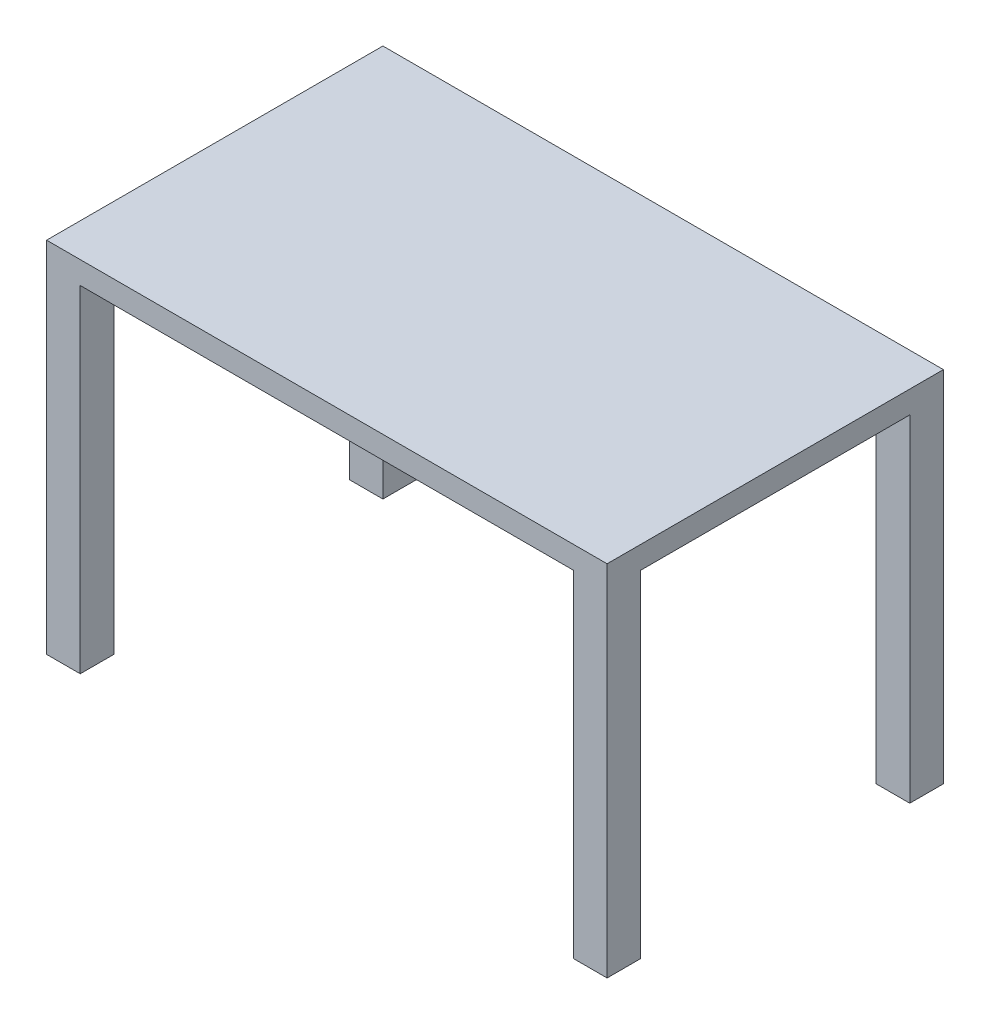
ISO-10303-21;
HEADER;
FILE_DESCRIPTION(('STEP AP214'),'2;1');
FILE_NAME('part.step','',(''),(''),'','','');
FILE_SCHEMA(('AUTOMOTIVE_DESIGN { 1 0 10303 214 1 1 1 1 }'));
ENDSEC;
DATA;
#1=APPLICATION_CONTEXT('core data for automotive mechanical design processes');
#2=APPLICATION_PROTOCOL_DEFINITION('international standard','automotive_design',2000,#1);
#3=PRODUCT_CONTEXT('',#1,'mechanical');
#4=PRODUCT('Part','Part','',(#3));
#5=PRODUCT_RELATED_PRODUCT_CATEGORY('part','',(#4));
#6=PRODUCT_DEFINITION_FORMATION('','',#4);
#7=PRODUCT_DEFINITION_CONTEXT('part definition',#1,'design');
#8=PRODUCT_DEFINITION('design','',#6,#7);
#9=PRODUCT_DEFINITION_SHAPE('','',#8);
#10=(LENGTH_UNIT() NAMED_UNIT(*) SI_UNIT(.MILLI.,.METRE.));
#11=(NAMED_UNIT(*) PLANE_ANGLE_UNIT() SI_UNIT($,.RADIAN.));
#12=(NAMED_UNIT(*) SI_UNIT($,.STERADIAN.) SOLID_ANGLE_UNIT());
#13=UNCERTAINTY_MEASURE_WITH_UNIT(LENGTH_MEASURE(1.E-05),#10,'distance_accuracy_value','');
#14=(GEOMETRIC_REPRESENTATION_CONTEXT(3) GLOBAL_UNCERTAINTY_ASSIGNED_CONTEXT((#13)) GLOBAL_UNIT_ASSIGNED_CONTEXT((#10,
#11,#12)) REPRESENTATION_CONTEXT('',''));
#15=CARTESIAN_POINT('',(0.,0.,0.));
#16=DIRECTION('',(0.,0.,1.));
#17=DIRECTION('',(1.,0.,0.));
#18=AXIS2_PLACEMENT_3D('',#15,#16,#17);
#19=CARTESIAN_POINT('',(0.,0.,0.));
#20=DIRECTION('',(0.,-1.,0.));
#21=DIRECTION('',(0.,0.,-1.));
#22=AXIS2_PLACEMENT_3D('',#19,#20,#21);
#23=PLANE('',#22);
#24=DIRECTION('',(-1.,0.,0.));
#25=VECTOR('',#24,1.);
#26=CARTESIAN_POINT('',(-125.,0.,-60.));
#27=LINE('',#26,#25);
#28=CARTESIAN_POINT('',(-110.,0.,-60.));
#29=VERTEX_POINT('',#28);
#30=CARTESIAN_POINT('',(-125.,0.,-60.0000000000001));
#31=VERTEX_POINT('',#30);
#32=EDGE_CURVE('E174',#29,#31,#27,.T.);
#33=ORIENTED_EDGE('',*,*,#32,.F.);
#34=DIRECTION('',(0.,0.,1.));
#35=VECTOR('',#34,1.);
#36=CARTESIAN_POINT('',(-110.,0.,-75.));
#37=LINE('',#36,#35);
#38=CARTESIAN_POINT('',(-110.,0.,-75.));
#39=VERTEX_POINT('',#38);
#40=EDGE_CURVE('E518',#39,#29,#37,.T.);
#41=ORIENTED_EDGE('',*,*,#40,.F.);
#42=DIRECTION('',(-1.,0.,0.));
#43=VECTOR('',#42,1.);
#44=CARTESIAN_POINT('',(-125.,0.,-75.));
#45=LINE('',#44,#43);
#46=CARTESIAN_POINT('',(110.,0.,-75.));
#47=VERTEX_POINT('',#46);
#48=EDGE_CURVE('E179',#47,#39,#45,.T.);
#49=ORIENTED_EDGE('',*,*,#48,.F.);
#50=DIRECTION('',(0.,0.,-1.));
#51=VECTOR('',#50,1.);
#52=CARTESIAN_POINT('',(110.,0.,-75.));
#53=LINE('',#52,#51);
#54=CARTESIAN_POINT('',(110.,0.,-60.));
#55=VERTEX_POINT('',#54);
#56=EDGE_CURVE('E254',#55,#47,#53,.T.);
#57=ORIENTED_EDGE('',*,*,#56,.F.);
#58=DIRECTION('',(-1.,0.,0.));
#59=VECTOR('',#58,1.);
#60=CARTESIAN_POINT('',(125.,0.,-60.));
#61=LINE('',#60,#59);
#62=CARTESIAN_POINT('',(125.,0.,-60.));
#63=VERTEX_POINT('',#62);
#64=EDGE_CURVE('E248',#63,#55,#61,.T.);
#65=ORIENTED_EDGE('',*,*,#64,.F.);
#66=DIRECTION('',(0.,0.,-1.));
#67=VECTOR('',#66,1.);
#68=CARTESIAN_POINT('',(125.,0.,75.));
#69=LINE('',#68,#67);
#70=CARTESIAN_POINT('',(125.,0.,60.));
#71=VERTEX_POINT('',#70);
#72=EDGE_CURVE('E281',#71,#63,#69,.T.);
#73=ORIENTED_EDGE('',*,*,#72,.F.);
#74=DIRECTION('',(1.,0.,0.));
#75=VECTOR('',#74,1.);
#76=CARTESIAN_POINT('',(125.,0.,60.));
#77=LINE('',#76,#75);
#78=CARTESIAN_POINT('',(110.,0.,60.));
#79=VERTEX_POINT('',#78);
#80=EDGE_CURVE('E222',#79,#71,#77,.T.);
#81=ORIENTED_EDGE('',*,*,#80,.F.);
#82=DIRECTION('',(0.,0.,-1.));
#83=VECTOR('',#82,1.);
#84=CARTESIAN_POINT('',(110.,0.,75.));
#85=LINE('',#84,#83);
#86=CARTESIAN_POINT('',(110.,0.,75.));
#87=VERTEX_POINT('',#86);
#88=EDGE_CURVE('E216',#87,#79,#85,.T.);
#89=ORIENTED_EDGE('',*,*,#88,.F.);
#90=DIRECTION('',(1.,0.,0.));
#91=VECTOR('',#90,1.);
#92=CARTESIAN_POINT('',(-125.,0.,75.));
#93=LINE('',#92,#91);
#94=CARTESIAN_POINT('',(-110.,0.,75.));
#95=VERTEX_POINT('',#94);
#96=EDGE_CURVE('E287',#95,#87,#93,.T.);
#97=ORIENTED_EDGE('',*,*,#96,.F.);
#98=DIRECTION('',(0.,0.,1.));
#99=VECTOR('',#98,1.);
#100=CARTESIAN_POINT('',(-110.,0.,75.));
#101=LINE('',#100,#99);
#102=CARTESIAN_POINT('',(-110.,0.,60.));
#103=VERTEX_POINT('',#102);
#104=EDGE_CURVE('E185',#103,#95,#101,.T.);
#105=ORIENTED_EDGE('',*,*,#104,.F.);
#106=DIRECTION('',(1.,0.,0.));
#107=VECTOR('',#106,1.);
#108=CARTESIAN_POINT('',(-125.,0.,60.));
#109=LINE('',#108,#107);
#110=CARTESIAN_POINT('',(-125.,0.,60.));
#111=VERTEX_POINT('',#110);
#112=EDGE_CURVE('E181',#111,#103,#109,.T.);
#113=ORIENTED_EDGE('',*,*,#112,.F.);
#114=DIRECTION('',(0.,0.,1.));
#115=VECTOR('',#114,1.);
#116=CARTESIAN_POINT('',(-125.,0.,75.));
#117=LINE('',#116,#115);
#118=EDGE_CURVE('E301',#31,#111,#117,.T.);
#119=ORIENTED_EDGE('',*,*,#118,.F.);
#120=EDGE_LOOP('',(#33,#41,#49,#57,#65,#73,#81,#89,#97,#105,#113,#119));
#121=FACE_BOUND('',#120,.T.);
#122=ADVANCED_FACE('F39',(#121),#23,.T.);
#123=CARTESIAN_POINT('',(125.,10.,75.));
#124=DIRECTION('',(-1.,0.,0.));
#125=DIRECTION('',(0.,0.,1.));
#126=AXIS2_PLACEMENT_3D('',#123,#124,#125);
#127=PLANE('',#126);
#128=DIRECTION('',(0.,-1.,0.));
#129=VECTOR('',#128,1.);
#130=CARTESIAN_POINT('',(125.,10.,75.));
#131=LINE('',#130,#129);
#132=CARTESIAN_POINT('',(125.,10.,75.));
#133=VERTEX_POINT('',#132);
#134=CARTESIAN_POINT('',(125.,-150.,75.));
#135=VERTEX_POINT('',#134);
#136=EDGE_CURVE('E296',#133,#135,#131,.T.);
#137=ORIENTED_EDGE('',*,*,#136,.T.);
#138=DIRECTION('',(0.,0.,1.));
#139=VECTOR('',#138,1.);
#140=CARTESIAN_POINT('',(125.,-150.,75.));
#141=LINE('',#140,#139);
#142=CARTESIAN_POINT('',(125.,-150.,60.));
#143=VERTEX_POINT('',#142);
#144=EDGE_CURVE('E228',#143,#135,#141,.T.);
#145=ORIENTED_EDGE('',*,*,#144,.F.);
#146=DIRECTION('',(0.,1.,0.));
#147=VECTOR('',#146,1.);
#148=CARTESIAN_POINT('',(125.,-150.,60.));
#149=LINE('',#148,#147);
#150=EDGE_CURVE('E232',#143,#71,#149,.T.);
#151=ORIENTED_EDGE('',*,*,#150,.T.);
#152=ORIENTED_EDGE('',*,*,#72,.T.);
#153=DIRECTION('',(0.,1.,0.));
#154=VECTOR('',#153,1.);
#155=CARTESIAN_POINT('',(125.,-150.,-60.));
#156=LINE('',#155,#154);
#157=CARTESIAN_POINT('',(125.,-150.,-60.));
#158=VERTEX_POINT('',#157);
#159=EDGE_CURVE('E277',#158,#63,#156,.T.);
#160=ORIENTED_EDGE('',*,*,#159,.F.);
#161=DIRECTION('',(0.,0.,1.));
#162=VECTOR('',#161,1.);
#163=CARTESIAN_POINT('',(125.,-150.,-75.));
#164=LINE('',#163,#162);
#165=CARTESIAN_POINT('',(125.,-150.,-75.));
#166=VERTEX_POINT('',#165);
#167=EDGE_CURVE('E249',#166,#158,#164,.T.);
#168=ORIENTED_EDGE('',*,*,#167,.F.);
#169=DIRECTION('',(0.,-1.,0.));
#170=VECTOR('',#169,1.);
#171=CARTESIAN_POINT('',(125.,10.,-75.));
#172=LINE('',#171,#170);
#173=CARTESIAN_POINT('',(125.,10.,-75.));
#174=VERTEX_POINT('',#173);
#175=EDGE_CURVE('E11',#174,#166,#172,.T.);
#176=ORIENTED_EDGE('',*,*,#175,.F.);
#177=DIRECTION('',(0.,0.,-1.));
#178=VECTOR('',#177,1.);
#179=CARTESIAN_POINT('',(125.,10.,75.));
#180=LINE('',#179,#178);
#181=EDGE_CURVE('E282',#133,#174,#180,.T.);
#182=ORIENTED_EDGE('',*,*,#181,.F.);
#183=EDGE_LOOP('',(#137,#145,#151,#152,#160,#168,#176,#182));
#184=FACE_BOUND('',#183,.T.);
#185=ADVANCED_FACE('F41',(#184),#127,.F.);
#186=CARTESIAN_POINT('',(-125.,10.,-75.));
#187=DIRECTION('',(0.,0.,1.));
#188=DIRECTION('',(1.,0.,0.));
#189=AXIS2_PLACEMENT_3D('',#186,#187,#188);
#190=PLANE('',#189);
#191=ORIENTED_EDGE('',*,*,#175,.T.);
#192=DIRECTION('',(1.,0.,0.));
#193=VECTOR('',#192,1.);
#194=CARTESIAN_POINT('',(125.,-150.,-75.));
#195=LINE('',#194,#193);
#196=CARTESIAN_POINT('',(110.,-150.,-75.));
#197=VERTEX_POINT('',#196);
#198=EDGE_CURVE('E260',#197,#166,#195,.T.);
#199=ORIENTED_EDGE('',*,*,#198,.F.);
#200=DIRECTION('',(0.,1.,0.));
#201=VECTOR('',#200,1.);
#202=CARTESIAN_POINT('',(110.,-150.,-75.));
#203=LINE('',#202,#201);
#204=EDGE_CURVE('E264',#197,#47,#203,.T.);
#205=ORIENTED_EDGE('',*,*,#204,.T.);
#206=ORIENTED_EDGE('',*,*,#48,.T.);
#207=DIRECTION('',(0.,1.,0.));
#208=VECTOR('',#207,1.);
#209=CARTESIAN_POINT('',(-110.,-150.,-75.));
#210=LINE('',#209,#208);
#211=CARTESIAN_POINT('',(-110.,-150.,-75.));
#212=VERTEX_POINT('',#211);
#213=EDGE_CURVE('E157',#212,#39,#210,.T.);
#214=ORIENTED_EDGE('',*,*,#213,.F.);
#215=DIRECTION('',(1.,0.,0.));
#216=VECTOR('',#215,1.);
#217=CARTESIAN_POINT('',(-125.,-150.,-75.));
#218=LINE('',#217,#216);
#219=CARTESIAN_POINT('',(-125.,-150.,-75.));
#220=VERTEX_POINT('',#219);
#221=EDGE_CURVE('E165',#220,#212,#218,.T.);
#222=ORIENTED_EDGE('',*,*,#221,.F.);
#223=DIRECTION('',(0.,-1.,0.));
#224=VECTOR('',#223,1.);
#225=CARTESIAN_POINT('',(-125.,10.,-75.));
#226=LINE('',#225,#224);
#227=CARTESIAN_POINT('',(-125.,10.,-75.));
#228=VERTEX_POINT('',#227);
#229=EDGE_CURVE('E48',#228,#220,#226,.T.);
#230=ORIENTED_EDGE('',*,*,#229,.F.);
#231=DIRECTION('',(-1.,0.,0.));
#232=VECTOR('',#231,1.);
#233=CARTESIAN_POINT('',(-125.,10.,-75.));
#234=LINE('',#233,#232);
#235=EDGE_CURVE('E286',#174,#228,#234,.T.);
#236=ORIENTED_EDGE('',*,*,#235,.F.);
#237=EDGE_LOOP('',(#191,#199,#205,#206,#214,#222,#230,#236));
#238=FACE_BOUND('',#237,.T.);
#239=ADVANCED_FACE('F177',(#238),#190,.F.);
#240=CARTESIAN_POINT('',(-125.,10.,75.));
#241=DIRECTION('',(1.,0.,0.));
#242=DIRECTION('',(0.,0.,-1.));
#243=AXIS2_PLACEMENT_3D('',#240,#241,#242);
#244=PLANE('',#243);
#245=ORIENTED_EDGE('',*,*,#229,.T.);
#246=DIRECTION('',(0.,0.,-1.));
#247=VECTOR('',#246,1.);
#248=CARTESIAN_POINT('',(-125.,-150.,-75.));
#249=LINE('',#248,#247);
#250=CARTESIAN_POINT('',(-125.,-150.,-60.));
#251=VERTEX_POINT('',#250);
#252=EDGE_CURVE('E170',#251,#220,#249,.T.);
#253=ORIENTED_EDGE('',*,*,#252,.F.);
#254=DIRECTION('',(0.,1.,0.));
#255=VECTOR('',#254,1.);
#256=CARTESIAN_POINT('',(-125.,-150.,-60.));
#257=LINE('',#256,#255);
#258=EDGE_CURVE('E55',#251,#31,#257,.T.);
#259=ORIENTED_EDGE('',*,*,#258,.T.);
#260=ORIENTED_EDGE('',*,*,#118,.T.);
#261=DIRECTION('',(0.,1.,0.));
#262=VECTOR('',#261,1.);
#263=CARTESIAN_POINT('',(-125.,-150.,60.));
#264=LINE('',#263,#262);
#265=CARTESIAN_POINT('',(-125.,-150.,60.));
#266=VERTEX_POINT('',#265);
#267=EDGE_CURVE('E212',#266,#111,#264,.T.);
#268=ORIENTED_EDGE('',*,*,#267,.F.);
#269=DIRECTION('',(0.,0.,-1.));
#270=VECTOR('',#269,1.);
#271=CARTESIAN_POINT('',(-125.,-150.,75.));
#272=LINE('',#271,#270);
#273=CARTESIAN_POINT('',(-125.,-150.,75.));
#274=VERTEX_POINT('',#273);
#275=EDGE_CURVE('E190',#274,#266,#272,.T.);
#276=ORIENTED_EDGE('',*,*,#275,.F.);
#277=DIRECTION('',(0.,-1.,0.));
#278=VECTOR('',#277,1.);
#279=CARTESIAN_POINT('',(-125.,10.,75.));
#280=LINE('',#279,#278);
#281=CARTESIAN_POINT('',(-125.,10.,75.));
#282=VERTEX_POINT('',#281);
#283=EDGE_CURVE('E308',#282,#274,#280,.T.);
#284=ORIENTED_EDGE('',*,*,#283,.F.);
#285=DIRECTION('',(0.,0.,1.));
#286=VECTOR('',#285,1.);
#287=CARTESIAN_POINT('',(-125.,10.,75.));
#288=LINE('',#287,#286);
#289=EDGE_CURVE('E290',#228,#282,#288,.T.);
#290=ORIENTED_EDGE('',*,*,#289,.F.);
#291=EDGE_LOOP('',(#245,#253,#259,#260,#268,#276,#284,#290));
#292=FACE_BOUND('',#291,.T.);
#293=ADVANCED_FACE('F312',(#292),#244,.F.);
#294=CARTESIAN_POINT('',(-125.,10.,75.));
#295=DIRECTION('',(0.,0.,-1.));
#296=DIRECTION('',(-1.,0.,0.));
#297=AXIS2_PLACEMENT_3D('',#294,#295,#296);
#298=PLANE('',#297);
#299=ORIENTED_EDGE('',*,*,#283,.T.);
#300=DIRECTION('',(-1.,0.,0.));
#301=VECTOR('',#300,1.);
#302=CARTESIAN_POINT('',(-125.,-150.,75.));
#303=LINE('',#302,#301);
#304=CARTESIAN_POINT('',(-110.,-150.,75.));
#305=VERTEX_POINT('',#304);
#306=EDGE_CURVE('E200',#305,#274,#303,.T.);
#307=ORIENTED_EDGE('',*,*,#306,.F.);
#308=DIRECTION('',(0.,1.,0.));
#309=VECTOR('',#308,1.);
#310=CARTESIAN_POINT('',(-110.,-150.,75.));
#311=LINE('',#310,#309);
#312=EDGE_CURVE('E63',#305,#95,#311,.T.);
#313=ORIENTED_EDGE('',*,*,#312,.T.);
#314=ORIENTED_EDGE('',*,*,#96,.T.);
#315=DIRECTION('',(0.,1.,0.));
#316=VECTOR('',#315,1.);
#317=CARTESIAN_POINT('',(110.,-150.,75.));
#318=LINE('',#317,#316);
#319=CARTESIAN_POINT('',(110.,-150.,75.));
#320=VERTEX_POINT('',#319);
#321=EDGE_CURVE('E244',#320,#87,#318,.T.);
#322=ORIENTED_EDGE('',*,*,#321,.F.);
#323=DIRECTION('',(-1.,0.,0.));
#324=VECTOR('',#323,1.);
#325=CARTESIAN_POINT('',(125.,-150.,75.));
#326=LINE('',#325,#324);
#327=EDGE_CURVE('E217',#135,#320,#326,.T.);
#328=ORIENTED_EDGE('',*,*,#327,.F.);
#329=ORIENTED_EDGE('',*,*,#136,.F.);
#330=DIRECTION('',(1.,0.,0.));
#331=VECTOR('',#330,1.);
#332=CARTESIAN_POINT('',(-125.,10.,75.));
#333=LINE('',#332,#331);
#334=EDGE_CURVE('E293',#282,#133,#333,.T.);
#335=ORIENTED_EDGE('',*,*,#334,.F.);
#336=EDGE_LOOP('',(#299,#307,#313,#314,#322,#328,#329,#335));
#337=FACE_BOUND('',#336,.T.);
#338=ADVANCED_FACE('F344',(#337),#298,.F.);
#339=CARTESIAN_POINT('',(0.,10.,0.));
#340=DIRECTION('',(0.,-1.,0.));
#341=DIRECTION('',(0.,0.,-1.));
#342=AXIS2_PLACEMENT_3D('',#339,#340,#341);
#343=PLANE('',#342);
#344=ORIENTED_EDGE('',*,*,#181,.T.);
#345=ORIENTED_EDGE('',*,*,#235,.T.);
#346=ORIENTED_EDGE('',*,*,#289,.T.);
#347=ORIENTED_EDGE('',*,*,#334,.T.);
#348=EDGE_LOOP('',(#344,#345,#346,#347));
#349=FACE_BOUND('',#348,.T.);
#350=ADVANCED_FACE('F318',(#349),#343,.F.);
#351=CARTESIAN_POINT('',(125.,-150.,-60.));
#352=DIRECTION('',(0.,0.,-1.));
#353=DIRECTION('',(-1.,0.,0.));
#354=AXIS2_PLACEMENT_3D('',#351,#352,#353);
#355=PLANE('',#354);
#356=ORIENTED_EDGE('',*,*,#64,.T.);
#357=DIRECTION('',(0.,1.,0.));
#358=VECTOR('',#357,1.);
#359=CARTESIAN_POINT('',(110.,-150.,-60.));
#360=LINE('',#359,#358);
#361=CARTESIAN_POINT('',(110.,-150.,-60.));
#362=VERTEX_POINT('',#361);
#363=EDGE_CURVE('E273',#362,#55,#360,.T.);
#364=ORIENTED_EDGE('',*,*,#363,.F.);
#365=DIRECTION('',(-1.,0.,0.));
#366=VECTOR('',#365,1.);
#367=CARTESIAN_POINT('',(125.,-150.,-60.));
#368=LINE('',#367,#366);
#369=EDGE_CURVE('E253',#158,#362,#368,.T.);
#370=ORIENTED_EDGE('',*,*,#369,.F.);
#371=ORIENTED_EDGE('',*,*,#159,.T.);
#372=EDGE_LOOP('',(#356,#364,#370,#371));
#373=FACE_BOUND('',#372,.T.);
#374=ADVANCED_FACE('F336',(#373),#355,.F.);
#375=CARTESIAN_POINT('',(110.,-150.,-75.));
#376=DIRECTION('',(1.,0.,0.));
#377=DIRECTION('',(0.,0.,-1.));
#378=AXIS2_PLACEMENT_3D('',#375,#376,#377);
#379=PLANE('',#378);
#380=ORIENTED_EDGE('',*,*,#56,.T.);
#381=ORIENTED_EDGE('',*,*,#204,.F.);
#382=DIRECTION('',(0.,0.,-1.));
#383=VECTOR('',#382,1.);
#384=CARTESIAN_POINT('',(110.,-150.,-75.));
#385=LINE('',#384,#383);
#386=EDGE_CURVE('E257',#362,#197,#385,.T.);
#387=ORIENTED_EDGE('',*,*,#386,.F.);
#388=ORIENTED_EDGE('',*,*,#363,.T.);
#389=EDGE_LOOP('',(#380,#381,#387,#388));
#390=FACE_BOUND('',#389,.T.);
#391=ADVANCED_FACE('F330',(#390),#379,.F.);
#392=CARTESIAN_POINT('',(0.,-150.,0.));
#393=DIRECTION('',(0.,-1.,0.));
#394=DIRECTION('',(0.,0.,-1.));
#395=AXIS2_PLACEMENT_3D('',#392,#393,#394);
#396=PLANE('',#395);
#397=ORIENTED_EDGE('',*,*,#167,.T.);
#398=ORIENTED_EDGE('',*,*,#369,.T.);
#399=ORIENTED_EDGE('',*,*,#386,.T.);
#400=ORIENTED_EDGE('',*,*,#198,.T.);
#401=EDGE_LOOP('',(#397,#398,#399,#400));
#402=FACE_BOUND('',#401,.T.);
#403=ADVANCED_FACE('F325',(#402),#396,.T.);
#404=CARTESIAN_POINT('',(110.,-150.,75.));
#405=DIRECTION('',(1.,0.,0.));
#406=DIRECTION('',(0.,0.,-1.));
#407=AXIS2_PLACEMENT_3D('',#404,#405,#406);
#408=PLANE('',#407);
#409=ORIENTED_EDGE('',*,*,#88,.T.);
#410=DIRECTION('',(0.,1.,0.));
#411=VECTOR('',#410,1.);
#412=CARTESIAN_POINT('',(110.,-150.,60.));
#413=LINE('',#412,#411);
#414=CARTESIAN_POINT('',(110.,-150.,60.));
#415=VERTEX_POINT('',#414);
#416=EDGE_CURVE('E240',#415,#79,#413,.T.);
#417=ORIENTED_EDGE('',*,*,#416,.F.);
#418=DIRECTION('',(0.,0.,-1.));
#419=VECTOR('',#418,1.);
#420=CARTESIAN_POINT('',(110.,-150.,75.));
#421=LINE('',#420,#419);
#422=EDGE_CURVE('E221',#320,#415,#421,.T.);
#423=ORIENTED_EDGE('',*,*,#422,.F.);
#424=ORIENTED_EDGE('',*,*,#321,.T.);
#425=EDGE_LOOP('',(#409,#417,#423,#424));
#426=FACE_BOUND('',#425,.T.);
#427=ADVANCED_FACE('F427',(#426),#408,.F.);
#428=CARTESIAN_POINT('',(125.,-150.,60.));
#429=DIRECTION('',(0.,0.,1.));
#430=DIRECTION('',(1.,0.,0.));
#431=AXIS2_PLACEMENT_3D('',#428,#429,#430);
#432=PLANE('',#431);
#433=ORIENTED_EDGE('',*,*,#80,.T.);
#434=ORIENTED_EDGE('',*,*,#150,.F.);
#435=DIRECTION('',(1.,0.,0.));
#436=VECTOR('',#435,1.);
#437=CARTESIAN_POINT('',(125.,-150.,60.));
#438=LINE('',#437,#436);
#439=EDGE_CURVE('E225',#415,#143,#438,.T.);
#440=ORIENTED_EDGE('',*,*,#439,.F.);
#441=ORIENTED_EDGE('',*,*,#416,.T.);
#442=EDGE_LOOP('',(#433,#434,#440,#441));
#443=FACE_BOUND('',#442,.T.);
#444=ADVANCED_FACE('F435',(#443),#432,.F.);
#445=CARTESIAN_POINT('',(0.,-150.,0.));
#446=DIRECTION('',(0.,-1.,0.));
#447=DIRECTION('',(0.,0.,-1.));
#448=AXIS2_PLACEMENT_3D('',#445,#446,#447);
#449=PLANE('',#448);
#450=ORIENTED_EDGE('',*,*,#327,.T.);
#451=ORIENTED_EDGE('',*,*,#422,.T.);
#452=ORIENTED_EDGE('',*,*,#439,.T.);
#453=ORIENTED_EDGE('',*,*,#144,.T.);
#454=EDGE_LOOP('',(#450,#451,#452,#453));
#455=FACE_BOUND('',#454,.T.);
#456=ADVANCED_FACE('F444',(#455),#449,.T.);
#457=CARTESIAN_POINT('',(-125.,-150.,60.));
#458=DIRECTION('',(0.,0.,1.));
#459=DIRECTION('',(1.,0.,0.));
#460=AXIS2_PLACEMENT_3D('',#457,#458,#459);
#461=PLANE('',#460);
#462=ORIENTED_EDGE('',*,*,#112,.T.);
#463=DIRECTION('',(0.,1.,0.));
#464=VECTOR('',#463,1.);
#465=CARTESIAN_POINT('',(-110.,-150.,60.));
#466=LINE('',#465,#464);
#467=CARTESIAN_POINT('',(-110.,-150.,60.));
#468=VERTEX_POINT('',#467);
#469=EDGE_CURVE('E208',#468,#103,#466,.T.);
#470=ORIENTED_EDGE('',*,*,#469,.F.);
#471=DIRECTION('',(1.,0.,0.));
#472=VECTOR('',#471,1.);
#473=CARTESIAN_POINT('',(-125.,-150.,60.));
#474=LINE('',#473,#472);
#475=EDGE_CURVE('E194',#266,#468,#474,.T.);
#476=ORIENTED_EDGE('',*,*,#475,.F.);
#477=ORIENTED_EDGE('',*,*,#267,.T.);
#478=EDGE_LOOP('',(#462,#470,#476,#477));
#479=FACE_BOUND('',#478,.T.);
#480=ADVANCED_FACE('F453',(#479),#461,.F.);
#481=CARTESIAN_POINT('',(-110.,-150.,75.));
#482=DIRECTION('',(-1.,0.,0.));
#483=DIRECTION('',(0.,0.,1.));
#484=AXIS2_PLACEMENT_3D('',#481,#482,#483);
#485=PLANE('',#484);
#486=ORIENTED_EDGE('',*,*,#104,.T.);
#487=ORIENTED_EDGE('',*,*,#312,.F.);
#488=DIRECTION('',(0.,0.,1.));
#489=VECTOR('',#488,1.);
#490=CARTESIAN_POINT('',(-110.,-150.,75.));
#491=LINE('',#490,#489);
#492=EDGE_CURVE('E197',#468,#305,#491,.T.);
#493=ORIENTED_EDGE('',*,*,#492,.F.);
#494=ORIENTED_EDGE('',*,*,#469,.T.);
#495=EDGE_LOOP('',(#486,#487,#493,#494));
#496=FACE_BOUND('',#495,.T.);
#497=ADVANCED_FACE('F462',(#496),#485,.F.);
#498=CARTESIAN_POINT('',(0.,-150.,0.));
#499=DIRECTION('',(0.,-1.,0.));
#500=DIRECTION('',(0.,0.,-1.));
#501=AXIS2_PLACEMENT_3D('',#498,#499,#500);
#502=PLANE('',#501);
#503=ORIENTED_EDGE('',*,*,#275,.T.);
#504=ORIENTED_EDGE('',*,*,#475,.T.);
#505=ORIENTED_EDGE('',*,*,#492,.T.);
#506=ORIENTED_EDGE('',*,*,#306,.T.);
#507=EDGE_LOOP('',(#503,#504,#505,#506));
#508=FACE_BOUND('',#507,.T.);
#509=ADVANCED_FACE('F471',(#508),#502,.T.);
#510=CARTESIAN_POINT('',(-110.,-150.,-75.));
#511=DIRECTION('',(-1.,0.,0.));
#512=DIRECTION('',(0.,0.,1.));
#513=AXIS2_PLACEMENT_3D('',#510,#511,#512);
#514=PLANE('',#513);
#515=ORIENTED_EDGE('',*,*,#40,.T.);
#516=DIRECTION('',(0.,1.,0.));
#517=VECTOR('',#516,1.);
#518=CARTESIAN_POINT('',(-110.,-150.,-60.));
#519=LINE('',#518,#517);
#520=CARTESIAN_POINT('',(-110.,-150.,-60.));
#521=VERTEX_POINT('',#520);
#522=EDGE_CURVE('E160',#521,#29,#519,.T.);
#523=ORIENTED_EDGE('',*,*,#522,.F.);
#524=DIRECTION('',(0.,0.,1.));
#525=VECTOR('',#524,1.);
#526=CARTESIAN_POINT('',(-110.,-150.,-75.));
#527=LINE('',#526,#525);
#528=EDGE_CURVE('E153',#212,#521,#527,.T.);
#529=ORIENTED_EDGE('',*,*,#528,.F.);
#530=ORIENTED_EDGE('',*,*,#213,.T.);
#531=EDGE_LOOP('',(#515,#523,#529,#530));
#532=FACE_BOUND('',#531,.T.);
#533=ADVANCED_FACE('F155',(#532),#514,.F.);
#534=CARTESIAN_POINT('',(-125.,-150.,-60.));
#535=DIRECTION('',(0.,0.,-1.));
#536=DIRECTION('',(-1.,0.,0.));
#537=AXIS2_PLACEMENT_3D('',#534,#535,#536);
#538=PLANE('',#537);
#539=ORIENTED_EDGE('',*,*,#32,.T.);
#540=ORIENTED_EDGE('',*,*,#258,.F.);
#541=DIRECTION('',(-1.,0.,0.));
#542=VECTOR('',#541,1.);
#543=CARTESIAN_POINT('',(-125.,-150.,-60.));
#544=LINE('',#543,#542);
#545=EDGE_CURVE('E164',#521,#251,#544,.T.);
#546=ORIENTED_EDGE('',*,*,#545,.F.);
#547=ORIENTED_EDGE('',*,*,#522,.T.);
#548=EDGE_LOOP('',(#539,#540,#546,#547));
#549=FACE_BOUND('',#548,.T.);
#550=ADVANCED_FACE('F488',(#549),#538,.F.);
#551=CARTESIAN_POINT('',(0.,-150.,0.));
#552=DIRECTION('',(0.,-1.,0.));
#553=DIRECTION('',(0.,0.,-1.));
#554=AXIS2_PLACEMENT_3D('',#551,#552,#553);
#555=PLANE('',#554);
#556=ORIENTED_EDGE('',*,*,#221,.T.);
#557=ORIENTED_EDGE('',*,*,#528,.T.);
#558=ORIENTED_EDGE('',*,*,#545,.T.);
#559=ORIENTED_EDGE('',*,*,#252,.T.);
#560=EDGE_LOOP('',(#556,#557,#558,#559));
#561=FACE_BOUND('',#560,.T.);
#562=ADVANCED_FACE('F169',(#561),#555,.T.);
#563=CLOSED_SHELL('',(#122,#185,#239,#293,#338,#350,#374,#391,#403,#427,#444,#456,#480,#497,
#509,#533,#550,#562));
#564=MANIFOLD_SOLID_BREP('B2',#563);
#565=ADVANCED_BREP_SHAPE_REPRESENTATION('',(#18,#564),#14);
#566=SHAPE_DEFINITION_REPRESENTATION(#9,#565);
ENDSEC;
END-ISO-10303-21;
